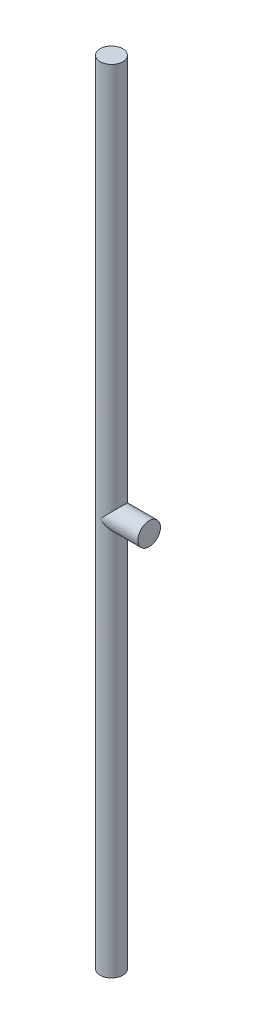
ISO-10303-21;
HEADER;
FILE_DESCRIPTION(('STEP AP214'),'2;1');
FILE_NAME('part.step','',(''),(''),'','','');
FILE_SCHEMA(('AUTOMOTIVE_DESIGN { 1 0 10303 214 1 1 1 1 }'));
ENDSEC;
DATA;
#1=APPLICATION_CONTEXT('core data for automotive mechanical design processes');
#2=APPLICATION_PROTOCOL_DEFINITION('international standard','automotive_design',2000,#1);
#3=PRODUCT_CONTEXT('',#1,'mechanical');
#4=PRODUCT('Part','Part','',(#3));
#5=PRODUCT_RELATED_PRODUCT_CATEGORY('part','',(#4));
#6=PRODUCT_DEFINITION_FORMATION('','',#4);
#7=PRODUCT_DEFINITION_CONTEXT('part definition',#1,'design');
#8=PRODUCT_DEFINITION('design','',#6,#7);
#9=PRODUCT_DEFINITION_SHAPE('','',#8);
#10=(LENGTH_UNIT() NAMED_UNIT(*) SI_UNIT(.MILLI.,.METRE.));
#11=(NAMED_UNIT(*) PLANE_ANGLE_UNIT() SI_UNIT($,.RADIAN.));
#12=(NAMED_UNIT(*) SI_UNIT($,.STERADIAN.) SOLID_ANGLE_UNIT());
#13=UNCERTAINTY_MEASURE_WITH_UNIT(LENGTH_MEASURE(1.E-05),#10,'distance_accuracy_value','');
#14=(GEOMETRIC_REPRESENTATION_CONTEXT(3) GLOBAL_UNCERTAINTY_ASSIGNED_CONTEXT((#13)) GLOBAL_UNIT_ASSIGNED_CONTEXT((#10,
#11,#12)) REPRESENTATION_CONTEXT('',''));
#15=CARTESIAN_POINT('',(0.,0.,0.));
#16=DIRECTION('',(0.,0.,1.));
#17=DIRECTION('',(1.,0.,0.));
#18=AXIS2_PLACEMENT_3D('',#15,#16,#17);
#19=CARTESIAN_POINT('',(0.,-5250.,0.));
#20=DIRECTION('',(0.,1.,0.));
#21=DIRECTION('',(0.,0.,1.));
#22=AXIS2_PLACEMENT_3D('',#19,#20,#21);
#23=CYLINDRICAL_SURFACE('',#22,149.999999974);
#24=CARTESIAN_POINT('',(0.,-5250.,0.));
#25=DIRECTION('',(0.,1.,0.));
#26=DIRECTION('',(0.,0.,1.));
#27=AXIS2_PLACEMENT_3D('',#24,#25,#26);
#28=CIRCLE('',#27,149.999999974);
#29=CARTESIAN_POINT('',(0.,-5250.,149.999999974));
#30=VERTEX_POINT('',#29);
#31=EDGE_CURVE('E57',#30,#30,#28,.T.);
#32=ORIENTED_EDGE('',*,*,#31,.T.);
#33=EDGE_LOOP('',(#32));
#34=FACE_BOUND('',#33,.T.);
#35=CARTESIAN_POINT('',(0.,5250.,0.));
#36=DIRECTION('',(0.,1.,0.));
#37=DIRECTION('',(0.,0.,1.));
#38=AXIS2_PLACEMENT_3D('',#35,#36,#37);
#39=CIRCLE('',#38,149.999999974);
#40=CARTESIAN_POINT('',(0.,5250.,149.999999974));
#41=VERTEX_POINT('',#40);
#42=EDGE_CURVE('E71',#41,#41,#39,.T.);
#43=ORIENTED_EDGE('',*,*,#42,.F.);
#44=EDGE_LOOP('',(#43));
#45=FACE_BOUND('',#44,.T.);
#46=CARTESIAN_POINT('',(0.,0.,0.));
#47=DIRECTION('',(0.707106781186547,0.707106781186547,0.));
#48=DIRECTION('',(-0.707106781186547,0.707106781186547,0.));
#49=AXIS2_PLACEMENT_3D('',#46,#47,#48);
#50=ELLIPSE('',#49,212.132034319195,149.999999974);
#51=CARTESIAN_POINT('',(0.,0.,-149.999999974));
#52=VERTEX_POINT('',#51);
#53=CARTESIAN_POINT('',(0.,0.,149.999999974));
#54=VERTEX_POINT('',#53);
#55=EDGE_CURVE('E47',#52,#54,#50,.F.);
#56=ORIENTED_EDGE('',*,*,#55,.T.);
#57=CARTESIAN_POINT('',(0.,0.,0.));
#58=DIRECTION('',(-0.707106781186547,0.707106781186547,0.));
#59=DIRECTION('',(0.707106781186547,0.707106781186547,0.));
#60=AXIS2_PLACEMENT_3D('',#57,#58,#59);
#61=ELLIPSE('',#60,212.132034319195,149.999999974);
#62=EDGE_CURVE('E11',#54,#52,#61,.T.);
#63=ORIENTED_EDGE('',*,*,#62,.T.);
#64=EDGE_LOOP('',(#56,#63));
#65=FACE_BOUND('',#64,.T.);
#66=ADVANCED_FACE('F39',(#34,#45,#65),#23,.T.);
#67=CARTESIAN_POINT('',(0.,-5250.,0.));
#68=DIRECTION('',(0.,1.,0.));
#69=DIRECTION('',(0.,0.,1.));
#70=AXIS2_PLACEMENT_3D('',#67,#68,#69);
#71=PLANE('',#70);
#72=ORIENTED_EDGE('',*,*,#31,.F.);
#73=EDGE_LOOP('',(#72));
#74=FACE_BOUND('',#73,.T.);
#75=ADVANCED_FACE('F59',(#74),#71,.F.);
#76=CARTESIAN_POINT('',(0.,5250.,0.));
#77=DIRECTION('',(0.,1.,0.));
#78=DIRECTION('',(0.,0.,1.));
#79=AXIS2_PLACEMENT_3D('',#76,#77,#78);
#80=PLANE('',#79);
#81=ORIENTED_EDGE('',*,*,#42,.T.);
#82=EDGE_LOOP('',(#81));
#83=FACE_BOUND('',#82,.T.);
#84=ADVANCED_FACE('F64',(#83),#80,.T.);
#85=CARTESIAN_POINT('',(499.999999998,0.,0.));
#86=DIRECTION('',(-1.,0.,0.));
#87=DIRECTION('',(0.,0.,1.));
#88=AXIS2_PLACEMENT_3D('',#85,#86,#87);
#89=CYLINDRICAL_SURFACE('',#88,149.999999974);
#90=ORIENTED_EDGE('',*,*,#62,.F.);
#91=ORIENTED_EDGE('',*,*,#55,.F.);
#92=EDGE_LOOP('',(#90,#91));
#93=FACE_BOUND('',#92,.T.);
#94=CARTESIAN_POINT('',(499.999999998,0.,0.));
#95=DIRECTION('',(1.,0.,0.));
#96=DIRECTION('',(0.,0.,-1.));
#97=AXIS2_PLACEMENT_3D('',#94,#95,#96);
#98=CIRCLE('',#97,149.999999974);
#99=CARTESIAN_POINT('',(499.999999998,0.,-149.999999974));
#100=VERTEX_POINT('',#99);
#101=EDGE_CURVE('E74',#100,#100,#98,.T.);
#102=ORIENTED_EDGE('',*,*,#101,.F.);
#103=EDGE_LOOP('',(#102));
#104=FACE_BOUND('',#103,.T.);
#105=ADVANCED_FACE('F53',(#93,#104),#89,.T.);
#106=CARTESIAN_POINT('',(499.999999998,0.,0.));
#107=DIRECTION('',(1.,0.,0.));
#108=DIRECTION('',(0.,0.,-1.));
#109=AXIS2_PLACEMENT_3D('',#106,#107,#108);
#110=PLANE('',#109);
#111=ORIENTED_EDGE('',*,*,#101,.T.);
#112=EDGE_LOOP('',(#111));
#113=FACE_BOUND('',#112,.T.);
#114=ADVANCED_FACE('F83',(#113),#110,.T.);
#115=CLOSED_SHELL('',(#66,#75,#84,#105,#114));
#116=MANIFOLD_SOLID_BREP('B2',#115);
#117=ADVANCED_BREP_SHAPE_REPRESENTATION('',(#18,#116),#14);
#118=SHAPE_DEFINITION_REPRESENTATION(#9,#117);
ENDSEC;
END-ISO-10303-21;
